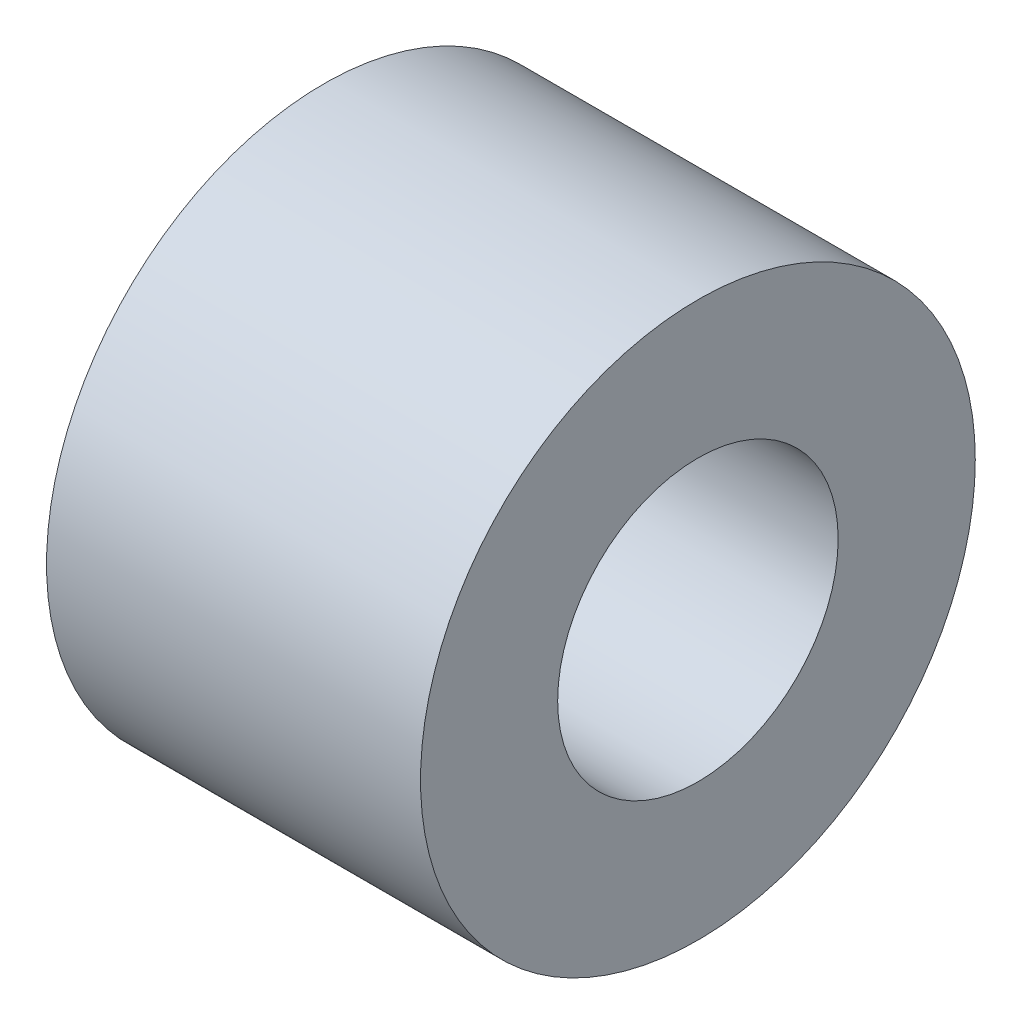
ISO-10303-21;
HEADER;
FILE_DESCRIPTION(('STEP AP214'),'2;1');
FILE_NAME('part.step','',(''),(''),'','','');
FILE_SCHEMA(('AUTOMOTIVE_DESIGN { 1 0 10303 214 1 1 1 1 }'));
ENDSEC;
DATA;
#1=APPLICATION_CONTEXT('core data for automotive mechanical design processes');
#2=APPLICATION_PROTOCOL_DEFINITION('international standard','automotive_design',2000,#1);
#3=PRODUCT_CONTEXT('',#1,'mechanical');
#4=PRODUCT('Part','Part','',(#3));
#5=PRODUCT_RELATED_PRODUCT_CATEGORY('part','',(#4));
#6=PRODUCT_DEFINITION_FORMATION('','',#4);
#7=PRODUCT_DEFINITION_CONTEXT('part definition',#1,'design');
#8=PRODUCT_DEFINITION('design','',#6,#7);
#9=PRODUCT_DEFINITION_SHAPE('','',#8);
#10=(LENGTH_UNIT() NAMED_UNIT(*) SI_UNIT(.MILLI.,.METRE.));
#11=(NAMED_UNIT(*) PLANE_ANGLE_UNIT() SI_UNIT($,.RADIAN.));
#12=(NAMED_UNIT(*) SI_UNIT($,.STERADIAN.) SOLID_ANGLE_UNIT());
#13=UNCERTAINTY_MEASURE_WITH_UNIT(LENGTH_MEASURE(1.E-05),#10,'distance_accuracy_value','');
#14=(GEOMETRIC_REPRESENTATION_CONTEXT(3) GLOBAL_UNCERTAINTY_ASSIGNED_CONTEXT((#13)) GLOBAL_UNIT_ASSIGNED_CONTEXT((#10,
#11,#12)) REPRESENTATION_CONTEXT('',''));
#15=CARTESIAN_POINT('',(0.,0.,0.));
#16=DIRECTION('',(0.,0.,1.));
#17=DIRECTION('',(1.,0.,0.));
#18=AXIS2_PLACEMENT_3D('',#15,#16,#17);
#19=CARTESIAN_POINT('',(30.,0.,0.));
#20=DIRECTION('',(1.,0.,0.));
#21=DIRECTION('',(0.,0.,-1.));
#22=AXIS2_PLACEMENT_3D('',#19,#20,#21);
#23=PLANE('',#22);
#24=CARTESIAN_POINT('',(30.,0.,0.));
#25=DIRECTION('',(1.,0.,0.));
#26=DIRECTION('',(0.,0.,-1.));
#27=AXIS2_PLACEMENT_3D('',#24,#25,#26);
#28=CIRCLE('',#27,22.25);
#29=CARTESIAN_POINT('',(30.,0.,-22.25));
#30=VERTEX_POINT('',#29);
#31=EDGE_CURVE('E10',#30,#30,#28,.T.);
#32=ORIENTED_EDGE('',*,*,#31,.T.);
#33=EDGE_LOOP('',(#32));
#34=FACE_BOUND('',#33,.T.);
#35=CARTESIAN_POINT('',(30.,0.,0.));
#36=DIRECTION('',(1.,0.,0.));
#37=DIRECTION('',(0.,0.,-1.));
#38=AXIS2_PLACEMENT_3D('',#35,#36,#37);
#39=CIRCLE('',#38,11.25);
#40=CARTESIAN_POINT('',(30.,0.,-11.25));
#41=VERTEX_POINT('',#40);
#42=EDGE_CURVE('E44',#41,#41,#39,.T.);
#43=ORIENTED_EDGE('',*,*,#42,.F.);
#44=EDGE_LOOP('',(#43));
#45=FACE_BOUND('',#44,.T.);
#46=ADVANCED_FACE('F33',(#34,#45),#23,.T.);
#47=CARTESIAN_POINT('',(0.,0.,0.));
#48=DIRECTION('',(1.,0.,0.));
#49=DIRECTION('',(0.,0.,-1.));
#50=AXIS2_PLACEMENT_3D('',#47,#48,#49);
#51=PLANE('',#50);
#52=CARTESIAN_POINT('',(0.,0.,0.));
#53=DIRECTION('',(1.,0.,0.));
#54=DIRECTION('',(0.,0.,-1.));
#55=AXIS2_PLACEMENT_3D('',#52,#53,#54);
#56=CIRCLE('',#55,22.25);
#57=CARTESIAN_POINT('',(0.,0.,-22.25));
#58=VERTEX_POINT('',#57);
#59=EDGE_CURVE('E37',#58,#58,#56,.T.);
#60=ORIENTED_EDGE('',*,*,#59,.F.);
#61=EDGE_LOOP('',(#60));
#62=FACE_BOUND('',#61,.T.);
#63=CARTESIAN_POINT('',(0.,0.,0.));
#64=DIRECTION('',(1.,0.,0.));
#65=DIRECTION('',(0.,0.,-1.));
#66=AXIS2_PLACEMENT_3D('',#63,#64,#65);
#67=CIRCLE('',#66,11.25);
#68=CARTESIAN_POINT('',(0.,0.,-11.25));
#69=VERTEX_POINT('',#68);
#70=EDGE_CURVE('E46',#69,#69,#67,.T.);
#71=ORIENTED_EDGE('',*,*,#70,.T.);
#72=EDGE_LOOP('',(#71));
#73=FACE_BOUND('',#72,.T.);
#74=ADVANCED_FACE('F56',(#62,#73),#51,.F.);
#75=CARTESIAN_POINT('',(30.,0.,0.));
#76=DIRECTION('',(-1.,0.,0.));
#77=DIRECTION('',(0.,0.,1.));
#78=AXIS2_PLACEMENT_3D('',#75,#76,#77);
#79=CYLINDRICAL_SURFACE('',#78,22.25);
#80=ORIENTED_EDGE('',*,*,#31,.F.);
#81=EDGE_LOOP('',(#80));
#82=FACE_BOUND('',#81,.T.);
#83=ORIENTED_EDGE('',*,*,#59,.T.);
#84=EDGE_LOOP('',(#83));
#85=FACE_BOUND('',#84,.T.);
#86=ADVANCED_FACE('F35',(#82,#85),#79,.T.);
#87=CARTESIAN_POINT('',(30.,0.,0.));
#88=DIRECTION('',(-1.,0.,0.));
#89=DIRECTION('',(0.,0.,1.));
#90=AXIS2_PLACEMENT_3D('',#87,#88,#89);
#91=CYLINDRICAL_SURFACE('',#90,11.25);
#92=ORIENTED_EDGE('',*,*,#42,.T.);
#93=EDGE_LOOP('',(#92));
#94=FACE_BOUND('',#93,.T.);
#95=ORIENTED_EDGE('',*,*,#70,.F.);
#96=EDGE_LOOP('',(#95));
#97=FACE_BOUND('',#96,.T.);
#98=ADVANCED_FACE('F52',(#94,#97),#91,.F.);
#99=CLOSED_SHELL('',(#46,#74,#86,#98));
#100=MANIFOLD_SOLID_BREP('B2',#99);
#101=ADVANCED_BREP_SHAPE_REPRESENTATION('',(#18,#100),#14);
#102=SHAPE_DEFINITION_REPRESENTATION(#9,#101);
ENDSEC;
END-ISO-10303-21;
